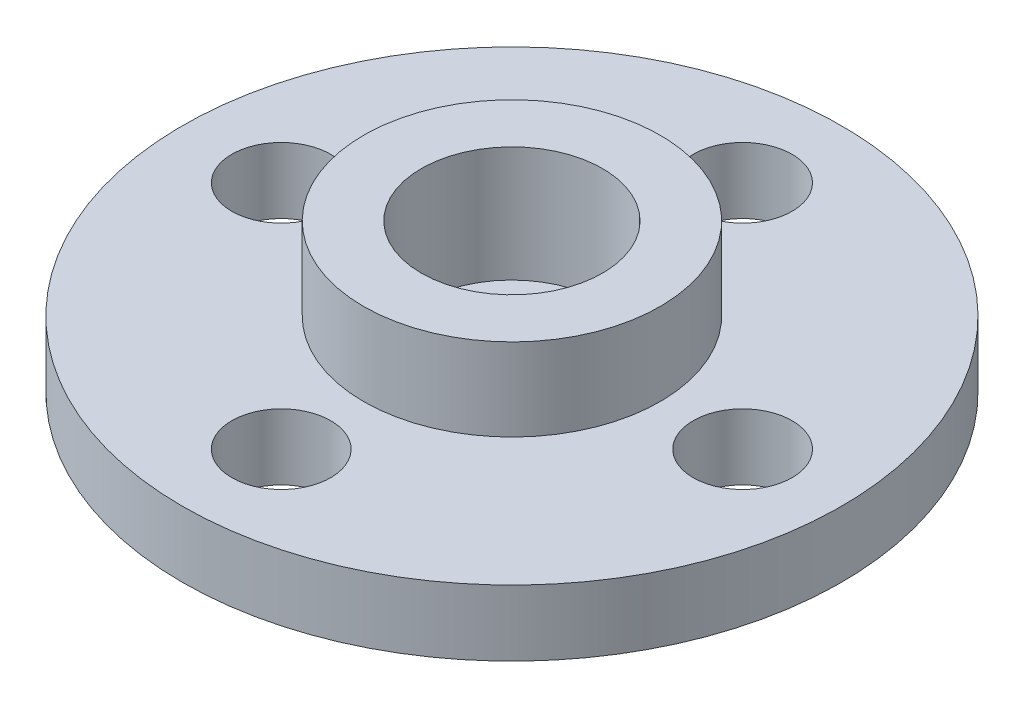
ISO-10303-21;
HEADER;
FILE_DESCRIPTION(('STEP AP214'),'2;1');
FILE_NAME('part.step','',(''),(''),'','','');
FILE_SCHEMA(('AUTOMOTIVE_DESIGN { 1 0 10303 214 1 1 1 1 }'));
ENDSEC;
DATA;
#1=APPLICATION_CONTEXT('core data for automotive mechanical design processes');
#2=APPLICATION_PROTOCOL_DEFINITION('international standard','automotive_design',2000,#1);
#3=PRODUCT_CONTEXT('',#1,'mechanical');
#4=PRODUCT('Part','Part','',(#3));
#5=PRODUCT_RELATED_PRODUCT_CATEGORY('part','',(#4));
#6=PRODUCT_DEFINITION_FORMATION('','',#4);
#7=PRODUCT_DEFINITION_CONTEXT('part definition',#1,'design');
#8=PRODUCT_DEFINITION('design','',#6,#7);
#9=PRODUCT_DEFINITION_SHAPE('','',#8);
#10=(LENGTH_UNIT() NAMED_UNIT(*) SI_UNIT(.MILLI.,.METRE.));
#11=(NAMED_UNIT(*) PLANE_ANGLE_UNIT() SI_UNIT($,.RADIAN.));
#12=(NAMED_UNIT(*) SI_UNIT($,.STERADIAN.) SOLID_ANGLE_UNIT());
#13=UNCERTAINTY_MEASURE_WITH_UNIT(LENGTH_MEASURE(1.E-05),#10,'distance_accuracy_value','');
#14=(GEOMETRIC_REPRESENTATION_CONTEXT(3) GLOBAL_UNCERTAINTY_ASSIGNED_CONTEXT((#13)) GLOBAL_UNIT_ASSIGNED_CONTEXT((#10,
#11,#12)) REPRESENTATION_CONTEXT('',''));
#15=CARTESIAN_POINT('',(0.,0.,0.));
#16=DIRECTION('',(0.,0.,1.));
#17=DIRECTION('',(1.,0.,0.));
#18=AXIS2_PLACEMENT_3D('',#15,#16,#17);
#19=CARTESIAN_POINT('',(0.,2.,0.));
#20=DIRECTION('',(0.,-1.,0.));
#21=DIRECTION('',(0.,0.,-1.));
#22=AXIS2_PLACEMENT_3D('',#19,#20,#21);
#23=CYLINDRICAL_SURFACE('',#22,10.);
#24=CARTESIAN_POINT('',(0.,2.,0.));
#25=DIRECTION('',(0.,1.,0.));
#26=DIRECTION('',(0.,0.,1.));
#27=AXIS2_PLACEMENT_3D('',#24,#25,#26);
#28=CIRCLE('',#27,10.);
#29=CARTESIAN_POINT('',(0.,2.,10.));
#30=VERTEX_POINT('',#29);
#31=EDGE_CURVE('E41',#30,#30,#28,.T.);
#32=ORIENTED_EDGE('',*,*,#31,.F.);
#33=EDGE_LOOP('',(#32));
#34=FACE_BOUND('',#33,.T.);
#35=CARTESIAN_POINT('',(0.,0.,0.));
#36=DIRECTION('',(0.,1.,0.));
#37=DIRECTION('',(0.,0.,1.));
#38=AXIS2_PLACEMENT_3D('',#35,#36,#37);
#39=CIRCLE('',#38,10.);
#40=CARTESIAN_POINT('',(0.,0.,10.));
#41=VERTEX_POINT('',#40);
#42=EDGE_CURVE('E37',#41,#41,#39,.T.);
#43=ORIENTED_EDGE('',*,*,#42,.T.);
#44=EDGE_LOOP('',(#43));
#45=FACE_BOUND('',#44,.T.);
#46=ADVANCED_FACE('F34',(#34,#45),#23,.T.);
#47=CARTESIAN_POINT('',(0.,2.,0.));
#48=DIRECTION('',(0.,1.,0.));
#49=DIRECTION('',(0.,0.,1.));
#50=AXIS2_PLACEMENT_3D('',#47,#48,#49);
#51=PLANE('',#50);
#52=CARTESIAN_POINT('',(0.,2.,-7.));
#53=DIRECTION('',(0.,1.,0.));
#54=DIRECTION('',(0.,0.,1.));
#55=AXIS2_PLACEMENT_3D('',#52,#53,#54);
#56=CIRCLE('',#55,1.5);
#57=CARTESIAN_POINT('',(0.,2.,-5.5));
#58=VERTEX_POINT('',#57);
#59=EDGE_CURVE('E81',#58,#58,#56,.T.);
#60=ORIENTED_EDGE('',*,*,#59,.F.);
#61=EDGE_LOOP('',(#60));
#62=FACE_BOUND('',#61,.T.);
#63=CARTESIAN_POINT('',(7.0000000000002,2.,-1.98094713253425E-13));
#64=DIRECTION('',(0.,1.,0.));
#65=DIRECTION('',(0.,0.,1.));
#66=AXIS2_PLACEMENT_3D('',#63,#64,#65);
#67=CIRCLE('',#66,1.50000000000015);
#68=CARTESIAN_POINT('',(7.0000000000002,2.,1.49999999999996));
#69=VERTEX_POINT('',#68);
#70=EDGE_CURVE('E75',#69,#69,#67,.T.);
#71=ORIENTED_EDGE('',*,*,#70,.F.);
#72=EDGE_LOOP('',(#71));
#73=FACE_BOUND('',#72,.T.);
#74=CARTESIAN_POINT('',(3.9618942650685E-13,2.,7.));
#75=DIRECTION('',(0.,1.,0.));
#76=DIRECTION('',(0.,0.,1.));
#77=AXIS2_PLACEMENT_3D('',#74,#75,#76);
#78=CIRCLE('',#77,1.50000000000043);
#79=CARTESIAN_POINT('',(3.9618942650685E-13,2.,8.50000000000043));
#80=VERTEX_POINT('',#79);
#81=EDGE_CURVE('E69',#80,#80,#78,.T.);
#82=ORIENTED_EDGE('',*,*,#81,.F.);
#83=EDGE_LOOP('',(#82));
#84=FACE_BOUND('',#83,.T.);
#85=CARTESIAN_POINT('',(-6.9999999999998,2.,1.98951966012828E-13));
#86=DIRECTION('',(0.,1.,0.));
#87=DIRECTION('',(0.,0.,1.));
#88=AXIS2_PLACEMENT_3D('',#85,#86,#87);
#89=CIRCLE('',#88,1.50000000000032);
#90=CARTESIAN_POINT('',(-6.9999999999998,2.,1.50000000000052));
#91=VERTEX_POINT('',#90);
#92=EDGE_CURVE('E63',#91,#91,#89,.T.);
#93=ORIENTED_EDGE('',*,*,#92,.F.);
#94=EDGE_LOOP('',(#93));
#95=FACE_BOUND('',#94,.T.);
#96=CARTESIAN_POINT('',(0.,2.,0.));
#97=DIRECTION('',(0.,1.,0.));
#98=DIRECTION('',(0.,0.,1.));
#99=AXIS2_PLACEMENT_3D('',#96,#97,#98);
#100=CIRCLE('',#99,4.5);
#101=CARTESIAN_POINT('',(0.,2.,4.5));
#102=VERTEX_POINT('',#101);
#103=EDGE_CURVE('E10',#102,#102,#100,.T.);
#104=ORIENTED_EDGE('',*,*,#103,.F.);
#105=EDGE_LOOP('',(#104));
#106=FACE_BOUND('',#105,.T.);
#107=ORIENTED_EDGE('',*,*,#31,.T.);
#108=EDGE_LOOP('',(#107));
#109=FACE_BOUND('',#108,.T.);
#110=ADVANCED_FACE('F97',(#62,#73,#84,#95,#106,#109),#51,.T.);
#111=CARTESIAN_POINT('',(0.,0.,0.));
#112=DIRECTION('',(0.,1.,0.));
#113=DIRECTION('',(0.,0.,1.));
#114=AXIS2_PLACEMENT_3D('',#111,#112,#113);
#115=PLANE('',#114);
#116=CARTESIAN_POINT('',(0.,0.,-7.));
#117=DIRECTION('',(0.,1.,0.));
#118=DIRECTION('',(0.,0.,1.));
#119=AXIS2_PLACEMENT_3D('',#116,#117,#118);
#120=CIRCLE('',#119,1.5);
#121=CARTESIAN_POINT('',(0.,0.,-5.5));
#122=VERTEX_POINT('',#121);
#123=EDGE_CURVE('E60',#122,#122,#120,.T.);
#124=ORIENTED_EDGE('',*,*,#123,.T.);
#125=EDGE_LOOP('',(#124));
#126=FACE_BOUND('',#125,.T.);
#127=CARTESIAN_POINT('',(7.0000000000002,0.,-1.98094713253425E-13));
#128=DIRECTION('',(0.,1.,0.));
#129=DIRECTION('',(0.,0.,1.));
#130=AXIS2_PLACEMENT_3D('',#127,#128,#129);
#131=CIRCLE('',#130,1.50000000000015);
#132=CARTESIAN_POINT('',(7.0000000000002,0.,1.49999999999996));
#133=VERTEX_POINT('',#132);
#134=EDGE_CURVE('E78',#133,#133,#131,.T.);
#135=ORIENTED_EDGE('',*,*,#134,.T.);
#136=EDGE_LOOP('',(#135));
#137=FACE_BOUND('',#136,.T.);
#138=CARTESIAN_POINT('',(3.9618942650685E-13,0.,7.));
#139=DIRECTION('',(0.,1.,0.));
#140=DIRECTION('',(0.,0.,1.));
#141=AXIS2_PLACEMENT_3D('',#138,#139,#140);
#142=CIRCLE('',#141,1.50000000000043);
#143=CARTESIAN_POINT('',(3.9618942650685E-13,0.,8.50000000000043));
#144=VERTEX_POINT('',#143);
#145=EDGE_CURVE('E72',#144,#144,#142,.T.);
#146=ORIENTED_EDGE('',*,*,#145,.T.);
#147=EDGE_LOOP('',(#146));
#148=FACE_BOUND('',#147,.T.);
#149=CARTESIAN_POINT('',(-6.9999999999998,0.,1.98951966012828E-13));
#150=DIRECTION('',(0.,1.,0.));
#151=DIRECTION('',(0.,0.,1.));
#152=AXIS2_PLACEMENT_3D('',#149,#150,#151);
#153=CIRCLE('',#152,1.50000000000032);
#154=CARTESIAN_POINT('',(-6.9999999999998,0.,1.50000000000052));
#155=VERTEX_POINT('',#154);
#156=EDGE_CURVE('E66',#155,#155,#153,.T.);
#157=ORIENTED_EDGE('',*,*,#156,.T.);
#158=EDGE_LOOP('',(#157));
#159=FACE_BOUND('',#158,.T.);
#160=CARTESIAN_POINT('',(0.,0.,0.));
#161=DIRECTION('',(0.,1.,0.));
#162=DIRECTION('',(0.,0.,1.));
#163=AXIS2_PLACEMENT_3D('',#160,#161,#162);
#164=CIRCLE('',#163,1.5);
#165=CARTESIAN_POINT('',(0.,0.,1.5));
#166=VERTEX_POINT('',#165);
#167=EDGE_CURVE('E54',#166,#166,#164,.T.);
#168=ORIENTED_EDGE('',*,*,#167,.T.);
#169=EDGE_LOOP('',(#168));
#170=FACE_BOUND('',#169,.T.);
#171=ORIENTED_EDGE('',*,*,#42,.F.);
#172=EDGE_LOOP('',(#171));
#173=FACE_BOUND('',#172,.T.);
#174=ADVANCED_FACE('F87',(#126,#137,#148,#159,#170,#173),#115,.F.);
#175=CARTESIAN_POINT('',(0.,4.5,0.));
#176=DIRECTION('',(0.,-1.,0.));
#177=DIRECTION('',(0.,0.,-1.));
#178=AXIS2_PLACEMENT_3D('',#175,#176,#177);
#179=CYLINDRICAL_SURFACE('',#178,4.5);
#180=CARTESIAN_POINT('',(0.,4.5,0.));
#181=DIRECTION('',(0.,1.,0.));
#182=DIRECTION('',(0.,0.,1.));
#183=AXIS2_PLACEMENT_3D('',#180,#181,#182);
#184=CIRCLE('',#183,4.5);
#185=CARTESIAN_POINT('',(0.,4.5,4.5));
#186=VERTEX_POINT('',#185);
#187=EDGE_CURVE('E47',#186,#186,#184,.T.);
#188=ORIENTED_EDGE('',*,*,#187,.F.);
#189=EDGE_LOOP('',(#188));
#190=FACE_BOUND('',#189,.T.);
#191=ORIENTED_EDGE('',*,*,#103,.T.);
#192=EDGE_LOOP('',(#191));
#193=FACE_BOUND('',#192,.T.);
#194=ADVANCED_FACE('F116',(#190,#193),#179,.T.);
#195=CARTESIAN_POINT('',(0.,4.5,0.));
#196=DIRECTION('',(0.,1.,0.));
#197=DIRECTION('',(0.,0.,1.));
#198=AXIS2_PLACEMENT_3D('',#195,#196,#197);
#199=PLANE('',#198);
#200=CARTESIAN_POINT('',(0.,4.5,0.));
#201=DIRECTION('',(0.,1.,0.));
#202=DIRECTION('',(0.,0.,1.));
#203=AXIS2_PLACEMENT_3D('',#200,#201,#202);
#204=CIRCLE('',#203,2.75);
#205=CARTESIAN_POINT('',(0.,4.5,2.75));
#206=VERTEX_POINT('',#205);
#207=EDGE_CURVE('E51',#206,#206,#204,.T.);
#208=ORIENTED_EDGE('',*,*,#207,.F.);
#209=EDGE_LOOP('',(#208));
#210=FACE_BOUND('',#209,.T.);
#211=ORIENTED_EDGE('',*,*,#187,.T.);
#212=EDGE_LOOP('',(#211));
#213=FACE_BOUND('',#212,.T.);
#214=ADVANCED_FACE('F120',(#210,#213),#199,.T.);
#215=CARTESIAN_POINT('',(0.,1.,0.));
#216=DIRECTION('',(0.,1.,0.));
#217=DIRECTION('',(0.,0.,1.));
#218=AXIS2_PLACEMENT_3D('',#215,#216,#217);
#219=CYLINDRICAL_SURFACE('',#218,2.75);
#220=CARTESIAN_POINT('',(0.,1.,0.));
#221=DIRECTION('',(0.,1.,0.));
#222=DIRECTION('',(0.,0.,1.));
#223=AXIS2_PLACEMENT_3D('',#220,#221,#222);
#224=CIRCLE('',#223,2.75);
#225=CARTESIAN_POINT('',(0.,1.,2.75));
#226=VERTEX_POINT('',#225);
#227=EDGE_CURVE('E50',#226,#226,#224,.T.);
#228=ORIENTED_EDGE('',*,*,#227,.F.);
#229=EDGE_LOOP('',(#228));
#230=FACE_BOUND('',#229,.T.);
#231=ORIENTED_EDGE('',*,*,#207,.T.);
#232=EDGE_LOOP('',(#231));
#233=FACE_BOUND('',#232,.T.);
#234=ADVANCED_FACE('F126',(#230,#233),#219,.F.);
#235=CARTESIAN_POINT('',(0.,1.,0.));
#236=DIRECTION('',(0.,1.,0.));
#237=DIRECTION('',(0.,0.,1.));
#238=AXIS2_PLACEMENT_3D('',#235,#236,#237);
#239=PLANE('',#238);
#240=CARTESIAN_POINT('',(0.,1.,0.));
#241=DIRECTION('',(0.,1.,0.));
#242=DIRECTION('',(0.,0.,1.));
#243=AXIS2_PLACEMENT_3D('',#240,#241,#242);
#244=CIRCLE('',#243,1.5);
#245=CARTESIAN_POINT('',(0.,1.,1.5));
#246=VERTEX_POINT('',#245);
#247=EDGE_CURVE('E57',#246,#246,#244,.T.);
#248=ORIENTED_EDGE('',*,*,#247,.F.);
#249=EDGE_LOOP('',(#248));
#250=FACE_BOUND('',#249,.T.);
#251=ORIENTED_EDGE('',*,*,#227,.T.);
#252=EDGE_LOOP('',(#251));
#253=FACE_BOUND('',#252,.T.);
#254=ADVANCED_FACE('F130',(#250,#253),#239,.T.);
#255=CARTESIAN_POINT('',(0.,0.,0.));
#256=DIRECTION('',(0.,1.,0.));
#257=DIRECTION('',(0.,0.,1.));
#258=AXIS2_PLACEMENT_3D('',#255,#256,#257);
#259=CYLINDRICAL_SURFACE('',#258,1.5);
#260=ORIENTED_EDGE('',*,*,#167,.F.);
#261=EDGE_LOOP('',(#260));
#262=FACE_BOUND('',#261,.T.);
#263=ORIENTED_EDGE('',*,*,#247,.T.);
#264=EDGE_LOOP('',(#263));
#265=FACE_BOUND('',#264,.T.);
#266=ADVANCED_FACE('F134',(#262,#265),#259,.F.);
#267=CARTESIAN_POINT('',(-6.9999999999998,0.,1.98951966012828E-13));
#268=DIRECTION('',(0.,1.,0.));
#269=DIRECTION('',(0.,0.,1.));
#270=AXIS2_PLACEMENT_3D('',#267,#268,#269);
#271=CYLINDRICAL_SURFACE('',#270,1.50000000000032);
#272=ORIENTED_EDGE('',*,*,#156,.F.);
#273=EDGE_LOOP('',(#272));
#274=FACE_BOUND('',#273,.T.);
#275=ORIENTED_EDGE('',*,*,#92,.T.);
#276=EDGE_LOOP('',(#275));
#277=FACE_BOUND('',#276,.T.);
#278=ADVANCED_FACE('F138',(#274,#277),#271,.F.);
#279=CARTESIAN_POINT('',(3.9618942650685E-13,0.,7.));
#280=DIRECTION('',(0.,1.,0.));
#281=DIRECTION('',(0.,0.,1.));
#282=AXIS2_PLACEMENT_3D('',#279,#280,#281);
#283=CYLINDRICAL_SURFACE('',#282,1.50000000000043);
#284=ORIENTED_EDGE('',*,*,#145,.F.);
#285=EDGE_LOOP('',(#284));
#286=FACE_BOUND('',#285,.T.);
#287=ORIENTED_EDGE('',*,*,#81,.T.);
#288=EDGE_LOOP('',(#287));
#289=FACE_BOUND('',#288,.T.);
#290=ADVANCED_FACE('F142',(#286,#289),#283,.F.);
#291=CARTESIAN_POINT('',(7.0000000000002,0.,-1.98094713253425E-13));
#292=DIRECTION('',(0.,1.,0.));
#293=DIRECTION('',(0.,0.,1.));
#294=AXIS2_PLACEMENT_3D('',#291,#292,#293);
#295=CYLINDRICAL_SURFACE('',#294,1.50000000000015);
#296=ORIENTED_EDGE('',*,*,#134,.F.);
#297=EDGE_LOOP('',(#296));
#298=FACE_BOUND('',#297,.T.);
#299=ORIENTED_EDGE('',*,*,#70,.T.);
#300=EDGE_LOOP('',(#299));
#301=FACE_BOUND('',#300,.T.);
#302=ADVANCED_FACE('F93',(#298,#301),#295,.F.);
#303=CARTESIAN_POINT('',(0.,0.,-7.));
#304=DIRECTION('',(0.,1.,0.));
#305=DIRECTION('',(0.,0.,1.));
#306=AXIS2_PLACEMENT_3D('',#303,#304,#305);
#307=CYLINDRICAL_SURFACE('',#306,1.5);
#308=ORIENTED_EDGE('',*,*,#123,.F.);
#309=EDGE_LOOP('',(#308));
#310=FACE_BOUND('',#309,.T.);
#311=ORIENTED_EDGE('',*,*,#59,.T.);
#312=EDGE_LOOP('',(#311));
#313=FACE_BOUND('',#312,.T.);
#314=ADVANCED_FACE('F90',(#310,#313),#307,.F.);
#315=CLOSED_SHELL('',(#46,#110,#174,#194,#214,#234,#254,#266,#278,#290,#302,#314));
#316=MANIFOLD_SOLID_BREP('B2',#315);
#317=ADVANCED_BREP_SHAPE_REPRESENTATION('',(#18,#316),#14);
#318=SHAPE_DEFINITION_REPRESENTATION(#9,#317);
ENDSEC;
END-ISO-10303-21;
